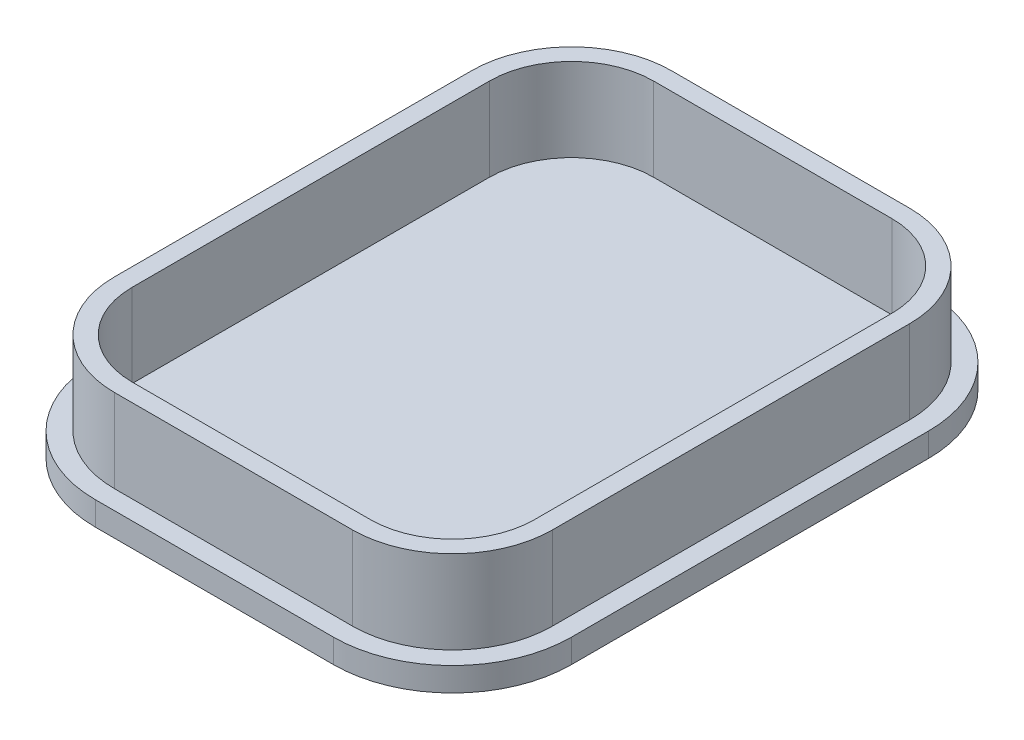
ISO-10303-21;
HEADER;
FILE_DESCRIPTION(('STEP AP214'),'2;1');
FILE_NAME('part.step','',(''),(''),'','','');
FILE_SCHEMA(('AUTOMOTIVE_DESIGN { 1 0 10303 214 1 1 1 1 }'));
ENDSEC;
DATA;
#1=APPLICATION_CONTEXT('core data for automotive mechanical design processes');
#2=APPLICATION_PROTOCOL_DEFINITION('international standard','automotive_design',2000,#1);
#3=PRODUCT_CONTEXT('',#1,'mechanical');
#4=PRODUCT('Part','Part','',(#3));
#5=PRODUCT_RELATED_PRODUCT_CATEGORY('part','',(#4));
#6=PRODUCT_DEFINITION_FORMATION('','',#4);
#7=PRODUCT_DEFINITION_CONTEXT('part definition',#1,'design');
#8=PRODUCT_DEFINITION('design','',#6,#7);
#9=PRODUCT_DEFINITION_SHAPE('','',#8);
#10=(LENGTH_UNIT() NAMED_UNIT(*) SI_UNIT(.MILLI.,.METRE.));
#11=(NAMED_UNIT(*) PLANE_ANGLE_UNIT() SI_UNIT($,.RADIAN.));
#12=(NAMED_UNIT(*) SI_UNIT($,.STERADIAN.) SOLID_ANGLE_UNIT());
#13=UNCERTAINTY_MEASURE_WITH_UNIT(LENGTH_MEASURE(1.E-05),#10,'distance_accuracy_value','');
#14=(GEOMETRIC_REPRESENTATION_CONTEXT(3) GLOBAL_UNCERTAINTY_ASSIGNED_CONTEXT((#13)) GLOBAL_UNIT_ASSIGNED_CONTEXT((#10,
#11,#12)) REPRESENTATION_CONTEXT('',''));
#15=CARTESIAN_POINT('',(0.,0.,0.));
#16=DIRECTION('',(0.,0.,1.));
#17=DIRECTION('',(1.,0.,0.));
#18=AXIS2_PLACEMENT_3D('',#15,#16,#17);
#19=CARTESIAN_POINT('',(9.65118240512013,2.,-15.2386014533297));
#20=DIRECTION('',(0.,-1.,0.));
#21=DIRECTION('',(0.,0.,-1.));
#22=AXIS2_PLACEMENT_3D('',#19,#20,#21);
#23=PLANE('',#22);
#24=CARTESIAN_POINT('',(9.65118240512013,2.,-15.2386014533297));
#25=DIRECTION('',(0.,1.,0.));
#26=DIRECTION('',(0.,0.,-1.));
#27=AXIS2_PLACEMENT_3D('',#24,#25,#26);
#28=CIRCLE('',#27,10.);
#29=CARTESIAN_POINT('',(19.6511824051201,2.,-15.2386014533297));
#30=VERTEX_POINT('',#29);
#31=CARTESIAN_POINT('',(9.65118240512013,2.,-25.2386014533297));
#32=VERTEX_POINT('',#31);
#33=EDGE_CURVE('E324',#30,#32,#28,.T.);
#34=ORIENTED_EDGE('',*,*,#33,.T.);
#35=DIRECTION('',(-1.,0.,0.));
#36=VECTOR('',#35,1.);
#37=CARTESIAN_POINT('',(-10.3488175948799,2.,-25.2386014533297));
#38=LINE('',#37,#36);
#39=CARTESIAN_POINT('',(-10.3488175948799,2.,-25.2386014533297));
#40=VERTEX_POINT('',#39);
#41=EDGE_CURVE('E327',#32,#40,#38,.T.);
#42=ORIENTED_EDGE('',*,*,#41,.T.);
#43=CARTESIAN_POINT('',(-10.3488175948799,2.,-15.2386014533297));
#44=DIRECTION('',(0.,1.,0.));
#45=DIRECTION('',(0.,0.,-1.));
#46=AXIS2_PLACEMENT_3D('',#43,#44,#45);
#47=CIRCLE('',#46,10.);
#48=CARTESIAN_POINT('',(-20.3488175948799,2.,-15.2386014533297));
#49=VERTEX_POINT('',#48);
#50=EDGE_CURVE('E330',#40,#49,#47,.T.);
#51=ORIENTED_EDGE('',*,*,#50,.T.);
#52=DIRECTION('',(0.,0.,1.));
#53=VECTOR('',#52,1.);
#54=CARTESIAN_POINT('',(-20.3488175948799,2.,14.7613985466703));
#55=LINE('',#54,#53);
#56=CARTESIAN_POINT('',(-20.3488175948799,2.,14.7613985466703));
#57=VERTEX_POINT('',#56);
#58=EDGE_CURVE('E332',#49,#57,#55,.T.);
#59=ORIENTED_EDGE('',*,*,#58,.T.);
#60=CARTESIAN_POINT('',(-10.3488175948799,2.,14.7613985466703));
#61=DIRECTION('',(0.,1.,0.));
#62=DIRECTION('',(0.,0.,-1.));
#63=AXIS2_PLACEMENT_3D('',#60,#61,#62);
#64=CIRCLE('',#63,10.);
#65=CARTESIAN_POINT('',(-10.3488175948799,2.,24.7613985466703));
#66=VERTEX_POINT('',#65);
#67=EDGE_CURVE('E334',#57,#66,#64,.T.);
#68=ORIENTED_EDGE('',*,*,#67,.T.);
#69=DIRECTION('',(1.,0.,0.));
#70=VECTOR('',#69,1.);
#71=CARTESIAN_POINT('',(-10.3488175948799,2.,24.7613985466703));
#72=LINE('',#71,#70);
#73=CARTESIAN_POINT('',(9.65118240512013,2.,24.7613985466703));
#74=VERTEX_POINT('',#73);
#75=EDGE_CURVE('E336',#66,#74,#72,.T.);
#76=ORIENTED_EDGE('',*,*,#75,.T.);
#77=CARTESIAN_POINT('',(9.65118240512013,2.,14.7613985466703));
#78=DIRECTION('',(0.,1.,0.));
#79=DIRECTION('',(0.,0.,1.));
#80=AXIS2_PLACEMENT_3D('',#77,#78,#79);
#81=CIRCLE('',#80,10.);
#82=CARTESIAN_POINT('',(19.6511824051201,2.,14.7613985466703));
#83=VERTEX_POINT('',#82);
#84=EDGE_CURVE('E338',#74,#83,#81,.T.);
#85=ORIENTED_EDGE('',*,*,#84,.T.);
#86=DIRECTION('',(0.,0.,-1.));
#87=VECTOR('',#86,1.);
#88=CARTESIAN_POINT('',(19.6511824051201,2.,14.7613985466703));
#89=LINE('',#88,#87);
#90=EDGE_CURVE('E340',#83,#30,#89,.T.);
#91=ORIENTED_EDGE('',*,*,#90,.T.);
#92=EDGE_LOOP('',(#34,#42,#51,#59,#68,#76,#85,#91));
#93=FACE_BOUND('',#92,.T.);
#94=CARTESIAN_POINT('',(-10.3488175948799,2.,-15.2386014533297));
#95=DIRECTION('',(0.,1.,0.));
#96=DIRECTION('',(0.,0.,1.));
#97=AXIS2_PLACEMENT_3D('',#94,#95,#96);
#98=CIRCLE('',#97,8.4);
#99=CARTESIAN_POINT('',(-10.3488175948799,2.,-23.6386014533297));
#100=VERTEX_POINT('',#99);
#101=CARTESIAN_POINT('',(-18.7488175948799,2.,-15.2386014533297));
#102=VERTEX_POINT('',#101);
#103=EDGE_CURVE('E211',#100,#102,#98,.T.);
#104=ORIENTED_EDGE('',*,*,#103,.F.);
#105=DIRECTION('',(-1.,0.,0.));
#106=VECTOR('',#105,1.);
#107=CARTESIAN_POINT('',(9.65118240512013,2.,-23.6386014533297));
#108=LINE('',#107,#106);
#109=CARTESIAN_POINT('',(9.65118240512014,2.,-23.6386014533297));
#110=VERTEX_POINT('',#109);
#111=EDGE_CURVE('E268',#110,#100,#108,.T.);
#112=ORIENTED_EDGE('',*,*,#111,.F.);
#113=CARTESIAN_POINT('',(9.65118240512013,2.,-15.2386014533297));
#114=DIRECTION('',(0.,1.,0.));
#115=DIRECTION('',(0.,0.,1.));
#116=AXIS2_PLACEMENT_3D('',#113,#114,#115);
#117=CIRCLE('',#116,8.4);
#118=CARTESIAN_POINT('',(18.0511824051201,2.,-15.2386014533297));
#119=VERTEX_POINT('',#118);
#120=EDGE_CURVE('E296',#119,#110,#117,.T.);
#121=ORIENTED_EDGE('',*,*,#120,.F.);
#122=DIRECTION('',(0.,0.,-1.));
#123=VECTOR('',#122,1.);
#124=CARTESIAN_POINT('',(18.0511824051201,2.,14.7613985466703));
#125=LINE('',#124,#123);
#126=CARTESIAN_POINT('',(18.0511824051201,2.,14.7613985466703));
#127=VERTEX_POINT('',#126);
#128=EDGE_CURVE('E293',#127,#119,#125,.T.);
#129=ORIENTED_EDGE('',*,*,#128,.F.);
#130=CARTESIAN_POINT('',(9.65118240512013,2.,14.7613985466703));
#131=DIRECTION('',(0.,1.,0.));
#132=DIRECTION('',(0.,0.,1.));
#133=AXIS2_PLACEMENT_3D('',#130,#131,#132);
#134=CIRCLE('',#133,8.4);
#135=CARTESIAN_POINT('',(9.65118240512014,2.,23.1613985466703));
#136=VERTEX_POINT('',#135);
#137=EDGE_CURVE('E290',#136,#127,#134,.T.);
#138=ORIENTED_EDGE('',*,*,#137,.F.);
#139=DIRECTION('',(1.,0.,0.));
#140=VECTOR('',#139,1.);
#141=CARTESIAN_POINT('',(-10.3488175948799,2.,23.1613985466703));
#142=LINE('',#141,#140);
#143=CARTESIAN_POINT('',(-10.3488175948799,2.,23.1613985466703));
#144=VERTEX_POINT('',#143);
#145=EDGE_CURVE('E287',#144,#136,#142,.T.);
#146=ORIENTED_EDGE('',*,*,#145,.F.);
#147=CARTESIAN_POINT('',(-10.3488175948799,2.,14.7613985466703));
#148=DIRECTION('',(0.,1.,0.));
#149=DIRECTION('',(0.,0.,1.));
#150=AXIS2_PLACEMENT_3D('',#147,#148,#149);
#151=CIRCLE('',#150,8.4);
#152=CARTESIAN_POINT('',(-18.7488175948799,2.,14.7613985466703));
#153=VERTEX_POINT('',#152);
#154=EDGE_CURVE('E53',#153,#144,#151,.T.);
#155=ORIENTED_EDGE('',*,*,#154,.F.);
#156=DIRECTION('',(0.,0.,1.));
#157=VECTOR('',#156,1.);
#158=CARTESIAN_POINT('',(-18.7488175948799,2.,-15.2386014533297));
#159=LINE('',#158,#157);
#160=EDGE_CURVE('E48',#102,#153,#159,.T.);
#161=ORIENTED_EDGE('',*,*,#160,.F.);
#162=EDGE_LOOP('',(#104,#112,#121,#129,#138,#146,#155,#161));
#163=FACE_BOUND('',#162,.T.);
#164=ADVANCED_FACE('F33',(#93,#163),#23,.F.);
#165=CARTESIAN_POINT('',(9.65118240512013,2.,-15.2386014533297));
#166=DIRECTION('',(0.,-1.,0.));
#167=DIRECTION('',(0.,0.,-1.));
#168=AXIS2_PLACEMENT_3D('',#165,#166,#167);
#169=CYLINDRICAL_SURFACE('',#168,10.);
#170=CARTESIAN_POINT('',(9.65118240512013,0.,-15.2386014533297));
#171=DIRECTION('',(0.,1.,0.));
#172=DIRECTION('',(0.,0.,-1.));
#173=AXIS2_PLACEMENT_3D('',#170,#171,#172);
#174=CIRCLE('',#173,10.);
#175=CARTESIAN_POINT('',(19.6511824051201,0.,-15.2386014533297));
#176=VERTEX_POINT('',#175);
#177=CARTESIAN_POINT('',(9.65118240512013,0.,-25.2386014533297));
#178=VERTEX_POINT('',#177);
#179=EDGE_CURVE('E323',#176,#178,#174,.T.);
#180=ORIENTED_EDGE('',*,*,#179,.T.);
#181=DIRECTION('',(0.,-1.,0.));
#182=VECTOR('',#181,1.);
#183=CARTESIAN_POINT('',(9.65118240512013,2.,-25.2386014533297));
#184=LINE('',#183,#182);
#185=EDGE_CURVE('E11',#32,#178,#184,.T.);
#186=ORIENTED_EDGE('',*,*,#185,.F.);
#187=ORIENTED_EDGE('',*,*,#33,.F.);
#188=DIRECTION('',(0.,-1.,0.));
#189=VECTOR('',#188,1.);
#190=CARTESIAN_POINT('',(19.6511824051201,2.,-15.2386014533297));
#191=LINE('',#190,#189);
#192=EDGE_CURVE('E342',#30,#176,#191,.T.);
#193=ORIENTED_EDGE('',*,*,#192,.T.);
#194=EDGE_LOOP('',(#180,#186,#187,#193));
#195=FACE_BOUND('',#194,.T.);
#196=ADVANCED_FACE('F35',(#195),#169,.T.);
#197=CARTESIAN_POINT('',(-10.3488175948799,2.,-25.2386014533297));
#198=DIRECTION('',(0.,0.,1.));
#199=DIRECTION('',(1.,0.,0.));
#200=AXIS2_PLACEMENT_3D('',#197,#198,#199);
#201=PLANE('',#200);
#202=DIRECTION('',(-1.,0.,0.));
#203=VECTOR('',#202,1.);
#204=CARTESIAN_POINT('',(-10.3488175948799,0.,-25.2386014533297));
#205=LINE('',#204,#203);
#206=CARTESIAN_POINT('',(-10.3488175948799,0.,-25.2386014533297));
#207=VERTEX_POINT('',#206);
#208=EDGE_CURVE('E345',#178,#207,#205,.T.);
#209=ORIENTED_EDGE('',*,*,#208,.T.);
#210=DIRECTION('',(0.,-1.,0.));
#211=VECTOR('',#210,1.);
#212=CARTESIAN_POINT('',(-10.3488175948799,2.,-25.2386014533297));
#213=LINE('',#212,#211);
#214=EDGE_CURVE('E41',#40,#207,#213,.T.);
#215=ORIENTED_EDGE('',*,*,#214,.F.);
#216=ORIENTED_EDGE('',*,*,#41,.F.);
#217=ORIENTED_EDGE('',*,*,#185,.T.);
#218=EDGE_LOOP('',(#209,#215,#216,#217));
#219=FACE_BOUND('',#218,.T.);
#220=ADVANCED_FACE('F401',(#219),#201,.F.);
#221=CARTESIAN_POINT('',(-10.3488175948799,2.,-15.2386014533297));
#222=DIRECTION('',(0.,-1.,0.));
#223=DIRECTION('',(0.,0.,-1.));
#224=AXIS2_PLACEMENT_3D('',#221,#222,#223);
#225=CYLINDRICAL_SURFACE('',#224,10.);
#226=CARTESIAN_POINT('',(-10.3488175948799,0.,-15.2386014533297));
#227=DIRECTION('',(0.,1.,0.));
#228=DIRECTION('',(0.,0.,-1.));
#229=AXIS2_PLACEMENT_3D('',#226,#227,#228);
#230=CIRCLE('',#229,10.);
#231=CARTESIAN_POINT('',(-20.3488175948799,0.,-15.2386014533297));
#232=VERTEX_POINT('',#231);
#233=EDGE_CURVE('E347',#207,#232,#230,.T.);
#234=ORIENTED_EDGE('',*,*,#233,.T.);
#235=DIRECTION('',(0.,-1.,0.));
#236=VECTOR('',#235,1.);
#237=CARTESIAN_POINT('',(-20.3488175948799,2.,-15.2386014533297));
#238=LINE('',#237,#236);
#239=EDGE_CURVE('E372',#49,#232,#238,.T.);
#240=ORIENTED_EDGE('',*,*,#239,.F.);
#241=ORIENTED_EDGE('',*,*,#50,.F.);
#242=ORIENTED_EDGE('',*,*,#214,.T.);
#243=EDGE_LOOP('',(#234,#240,#241,#242));
#244=FACE_BOUND('',#243,.T.);
#245=ADVANCED_FACE('F379',(#244),#225,.T.);
#246=CARTESIAN_POINT('',(-20.3488175948799,2.,14.7613985466703));
#247=DIRECTION('',(1.,0.,0.));
#248=DIRECTION('',(0.,0.,-1.));
#249=AXIS2_PLACEMENT_3D('',#246,#247,#248);
#250=PLANE('',#249);
#251=DIRECTION('',(0.,0.,1.));
#252=VECTOR('',#251,1.);
#253=CARTESIAN_POINT('',(-20.3488175948799,0.,14.7613985466703));
#254=LINE('',#253,#252);
#255=CARTESIAN_POINT('',(-20.3488175948799,0.,14.7613985466703));
#256=VERTEX_POINT('',#255);
#257=EDGE_CURVE('E349',#232,#256,#254,.T.);
#258=ORIENTED_EDGE('',*,*,#257,.T.);
#259=DIRECTION('',(0.,-1.,0.));
#260=VECTOR('',#259,1.);
#261=CARTESIAN_POINT('',(-20.3488175948799,2.,14.7613985466703));
#262=LINE('',#261,#260);
#263=EDGE_CURVE('E369',#57,#256,#262,.T.);
#264=ORIENTED_EDGE('',*,*,#263,.F.);
#265=ORIENTED_EDGE('',*,*,#58,.F.);
#266=ORIENTED_EDGE('',*,*,#239,.T.);
#267=EDGE_LOOP('',(#258,#264,#265,#266));
#268=FACE_BOUND('',#267,.T.);
#269=ADVANCED_FACE('F390',(#268),#250,.F.);
#270=CARTESIAN_POINT('',(-10.3488175948799,2.,14.7613985466703));
#271=DIRECTION('',(0.,-1.,0.));
#272=DIRECTION('',(0.,0.,-1.));
#273=AXIS2_PLACEMENT_3D('',#270,#271,#272);
#274=CYLINDRICAL_SURFACE('',#273,10.);
#275=CARTESIAN_POINT('',(-10.3488175948799,0.,14.7613985466703));
#276=DIRECTION('',(0.,1.,0.));
#277=DIRECTION('',(0.,0.,-1.));
#278=AXIS2_PLACEMENT_3D('',#275,#276,#277);
#279=CIRCLE('',#278,10.);
#280=CARTESIAN_POINT('',(-10.3488175948799,0.,24.7613985466703));
#281=VERTEX_POINT('',#280);
#282=EDGE_CURVE('E351',#256,#281,#279,.T.);
#283=ORIENTED_EDGE('',*,*,#282,.T.);
#284=DIRECTION('',(0.,-1.,0.));
#285=VECTOR('',#284,1.);
#286=CARTESIAN_POINT('',(-10.3488175948799,2.,24.7613985466703));
#287=LINE('',#286,#285);
#288=EDGE_CURVE('E366',#66,#281,#287,.T.);
#289=ORIENTED_EDGE('',*,*,#288,.F.);
#290=ORIENTED_EDGE('',*,*,#67,.F.);
#291=ORIENTED_EDGE('',*,*,#263,.T.);
#292=EDGE_LOOP('',(#283,#289,#290,#291));
#293=FACE_BOUND('',#292,.T.);
#294=ADVANCED_FACE('F394',(#293),#274,.T.);
#295=CARTESIAN_POINT('',(-10.3488175948799,2.,24.7613985466703));
#296=DIRECTION('',(0.,0.,-1.));
#297=DIRECTION('',(-1.,0.,0.));
#298=AXIS2_PLACEMENT_3D('',#295,#296,#297);
#299=PLANE('',#298);
#300=DIRECTION('',(1.,0.,0.));
#301=VECTOR('',#300,1.);
#302=CARTESIAN_POINT('',(-10.3488175948799,0.,24.7613985466703));
#303=LINE('',#302,#301);
#304=CARTESIAN_POINT('',(9.65118240512013,0.,24.7613985466703));
#305=VERTEX_POINT('',#304);
#306=EDGE_CURVE('E353',#281,#305,#303,.T.);
#307=ORIENTED_EDGE('',*,*,#306,.T.);
#308=DIRECTION('',(0.,-1.,0.));
#309=VECTOR('',#308,1.);
#310=CARTESIAN_POINT('',(9.65118240512013,2.,24.7613985466703));
#311=LINE('',#310,#309);
#312=EDGE_CURVE('E363',#74,#305,#311,.T.);
#313=ORIENTED_EDGE('',*,*,#312,.F.);
#314=ORIENTED_EDGE('',*,*,#75,.F.);
#315=ORIENTED_EDGE('',*,*,#288,.T.);
#316=EDGE_LOOP('',(#307,#313,#314,#315));
#317=FACE_BOUND('',#316,.T.);
#318=ADVANCED_FACE('F414',(#317),#299,.F.);
#319=CARTESIAN_POINT('',(9.65118240512013,2.,14.7613985466703));
#320=DIRECTION('',(0.,-1.,0.));
#321=DIRECTION('',(0.,0.,-1.));
#322=AXIS2_PLACEMENT_3D('',#319,#320,#321);
#323=CYLINDRICAL_SURFACE('',#322,10.);
#324=CARTESIAN_POINT('',(9.65118240512013,0.,14.7613985466703));
#325=DIRECTION('',(0.,1.,0.));
#326=DIRECTION('',(0.,0.,1.));
#327=AXIS2_PLACEMENT_3D('',#324,#325,#326);
#328=CIRCLE('',#327,10.);
#329=CARTESIAN_POINT('',(19.6511824051201,0.,14.7613985466703));
#330=VERTEX_POINT('',#329);
#331=EDGE_CURVE('E355',#305,#330,#328,.T.);
#332=ORIENTED_EDGE('',*,*,#331,.T.);
#333=DIRECTION('',(0.,-1.,0.));
#334=VECTOR('',#333,1.);
#335=CARTESIAN_POINT('',(19.6511824051201,2.,14.7613985466703));
#336=LINE('',#335,#334);
#337=EDGE_CURVE('E360',#83,#330,#336,.T.);
#338=ORIENTED_EDGE('',*,*,#337,.F.);
#339=ORIENTED_EDGE('',*,*,#84,.F.);
#340=ORIENTED_EDGE('',*,*,#312,.T.);
#341=EDGE_LOOP('',(#332,#338,#339,#340));
#342=FACE_BOUND('',#341,.T.);
#343=ADVANCED_FACE('F412',(#342),#323,.T.);
#344=CARTESIAN_POINT('',(19.6511824051201,2.,14.7613985466703));
#345=DIRECTION('',(-1.,0.,0.));
#346=DIRECTION('',(0.,0.,1.));
#347=AXIS2_PLACEMENT_3D('',#344,#345,#346);
#348=PLANE('',#347);
#349=DIRECTION('',(0.,0.,-1.));
#350=VECTOR('',#349,1.);
#351=CARTESIAN_POINT('',(19.6511824051201,0.,14.7613985466703));
#352=LINE('',#351,#350);
#353=EDGE_CURVE('E328',#330,#176,#352,.T.);
#354=ORIENTED_EDGE('',*,*,#353,.T.);
#355=ORIENTED_EDGE('',*,*,#192,.F.);
#356=ORIENTED_EDGE('',*,*,#90,.F.);
#357=ORIENTED_EDGE('',*,*,#337,.T.);
#358=EDGE_LOOP('',(#354,#355,#356,#357));
#359=FACE_BOUND('',#358,.T.);
#360=ADVANCED_FACE('F407',(#359),#348,.F.);
#361=CARTESIAN_POINT('',(9.65118240512013,0.,-15.2386014533297));
#362=DIRECTION('',(0.,-1.,0.));
#363=DIRECTION('',(0.,0.,-1.));
#364=AXIS2_PLACEMENT_3D('',#361,#362,#363);
#365=PLANE('',#364);
#366=ORIENTED_EDGE('',*,*,#179,.F.);
#367=ORIENTED_EDGE('',*,*,#353,.F.);
#368=ORIENTED_EDGE('',*,*,#331,.F.);
#369=ORIENTED_EDGE('',*,*,#306,.F.);
#370=ORIENTED_EDGE('',*,*,#282,.F.);
#371=ORIENTED_EDGE('',*,*,#257,.F.);
#372=ORIENTED_EDGE('',*,*,#233,.F.);
#373=ORIENTED_EDGE('',*,*,#208,.F.);
#374=EDGE_LOOP('',(#366,#367,#368,#369,#370,#371,#372,#373));
#375=FACE_BOUND('',#374,.T.);
#376=ADVANCED_FACE('F385',(#375),#365,.T.);
#377=CARTESIAN_POINT('',(-10.3488175948799,9.,-15.2386014533297));
#378=DIRECTION('',(0.,1.,0.));
#379=DIRECTION('',(0.,0.,1.));
#380=AXIS2_PLACEMENT_3D('',#377,#378,#379);
#381=PLANE('',#380);
#382=CARTESIAN_POINT('',(-10.3488175948799,9.,-15.2386014533297));
#383=DIRECTION('',(0.,1.,0.));
#384=DIRECTION('',(0.,0.,1.));
#385=AXIS2_PLACEMENT_3D('',#382,#383,#384);
#386=CIRCLE('',#385,8.4);
#387=CARTESIAN_POINT('',(-10.3488175948799,9.,-23.6386014533297));
#388=VERTEX_POINT('',#387);
#389=CARTESIAN_POINT('',(-18.7488175948799,9.,-15.2386014533297));
#390=VERTEX_POINT('',#389);
#391=EDGE_CURVE('E264',#388,#390,#386,.T.);
#392=ORIENTED_EDGE('',*,*,#391,.T.);
#393=DIRECTION('',(0.,0.,1.));
#394=VECTOR('',#393,1.);
#395=CARTESIAN_POINT('',(-18.7488175948799,9.,-15.2386014533297));
#396=LINE('',#395,#394);
#397=CARTESIAN_POINT('',(-18.7488175948799,9.,14.7613985466703));
#398=VERTEX_POINT('',#397);
#399=EDGE_CURVE('E267',#390,#398,#396,.T.);
#400=ORIENTED_EDGE('',*,*,#399,.T.);
#401=CARTESIAN_POINT('',(-10.3488175948799,9.,14.7613985466703));
#402=DIRECTION('',(0.,1.,0.));
#403=DIRECTION('',(0.,0.,1.));
#404=AXIS2_PLACEMENT_3D('',#401,#402,#403);
#405=CIRCLE('',#404,8.4);
#406=CARTESIAN_POINT('',(-10.3488175948799,9.,23.1613985466703));
#407=VERTEX_POINT('',#406);
#408=EDGE_CURVE('E270',#398,#407,#405,.T.);
#409=ORIENTED_EDGE('',*,*,#408,.T.);
#410=DIRECTION('',(1.,0.,0.));
#411=VECTOR('',#410,1.);
#412=CARTESIAN_POINT('',(-10.3488175948799,9.,23.1613985466703));
#413=LINE('',#412,#411);
#414=CARTESIAN_POINT('',(9.65118240512014,9.,23.1613985466703));
#415=VERTEX_POINT('',#414);
#416=EDGE_CURVE('E272',#407,#415,#413,.T.);
#417=ORIENTED_EDGE('',*,*,#416,.T.);
#418=CARTESIAN_POINT('',(9.65118240512013,9.,14.7613985466703));
#419=DIRECTION('',(0.,1.,0.));
#420=DIRECTION('',(0.,0.,1.));
#421=AXIS2_PLACEMENT_3D('',#418,#419,#420);
#422=CIRCLE('',#421,8.4);
#423=CARTESIAN_POINT('',(18.0511824051201,9.,14.7613985466703));
#424=VERTEX_POINT('',#423);
#425=EDGE_CURVE('E274',#415,#424,#422,.T.);
#426=ORIENTED_EDGE('',*,*,#425,.T.);
#427=DIRECTION('',(0.,0.,-1.));
#428=VECTOR('',#427,1.);
#429=CARTESIAN_POINT('',(18.0511824051201,9.,14.7613985466703));
#430=LINE('',#429,#428);
#431=CARTESIAN_POINT('',(18.0511824051201,9.,-15.2386014533297));
#432=VERTEX_POINT('',#431);
#433=EDGE_CURVE('E276',#424,#432,#430,.T.);
#434=ORIENTED_EDGE('',*,*,#433,.T.);
#435=CARTESIAN_POINT('',(9.65118240512013,9.,-15.2386014533297));
#436=DIRECTION('',(0.,1.,0.));
#437=DIRECTION('',(0.,0.,1.));
#438=AXIS2_PLACEMENT_3D('',#435,#436,#437);
#439=CIRCLE('',#438,8.4);
#440=CARTESIAN_POINT('',(9.65118240512014,9.,-23.6386014533297));
#441=VERTEX_POINT('',#440);
#442=EDGE_CURVE('E278',#432,#441,#439,.T.);
#443=ORIENTED_EDGE('',*,*,#442,.T.);
#444=DIRECTION('',(-1.,0.,0.));
#445=VECTOR('',#444,1.);
#446=CARTESIAN_POINT('',(9.65118240512013,9.,-23.6386014533297));
#447=LINE('',#446,#445);
#448=EDGE_CURVE('E280',#441,#388,#447,.T.);
#449=ORIENTED_EDGE('',*,*,#448,.T.);
#450=EDGE_LOOP('',(#392,#400,#409,#417,#426,#434,#443,#449));
#451=FACE_BOUND('',#450,.T.);
#452=DIRECTION('',(0.,0.,1.));
#453=VECTOR('',#452,1.);
#454=CARTESIAN_POINT('',(-17.2488175948799,9.,-15.2386014533297));
#455=LINE('',#454,#453);
#456=CARTESIAN_POINT('',(-17.2488175948799,9.,-15.2386014533297));
#457=VERTEX_POINT('',#456);
#458=CARTESIAN_POINT('',(-17.2488175948799,9.,14.7613985466703));
#459=VERTEX_POINT('',#458);
#460=EDGE_CURVE('E203',#457,#459,#455,.T.);
#461=ORIENTED_EDGE('',*,*,#460,.F.);
#462=CARTESIAN_POINT('',(-10.3488175948799,9.,-15.2386014533297));
#463=DIRECTION('',(0.,1.,0.));
#464=DIRECTION('',(0.,0.,1.));
#465=AXIS2_PLACEMENT_3D('',#462,#463,#464);
#466=CIRCLE('',#465,6.9);
#467=CARTESIAN_POINT('',(-10.3488175948799,9.,-22.1386014533297));
#468=VERTEX_POINT('',#467);
#469=EDGE_CURVE('E193',#468,#457,#466,.T.);
#470=ORIENTED_EDGE('',*,*,#469,.F.);
#471=DIRECTION('',(-1.,0.,0.));
#472=VECTOR('',#471,1.);
#473=CARTESIAN_POINT('',(9.65118240512013,9.,-22.1386014533297));
#474=LINE('',#473,#472);
#475=CARTESIAN_POINT('',(9.65118240512013,9.,-22.1386014533297));
#476=VERTEX_POINT('',#475);
#477=EDGE_CURVE('E230',#476,#468,#474,.T.);
#478=ORIENTED_EDGE('',*,*,#477,.F.);
#479=CARTESIAN_POINT('',(9.65118240512013,9.,-15.2386014533297));
#480=DIRECTION('',(0.,1.,0.));
#481=DIRECTION('',(0.,0.,1.));
#482=AXIS2_PLACEMENT_3D('',#479,#480,#481);
#483=CIRCLE('',#482,6.9);
#484=CARTESIAN_POINT('',(16.5511824051201,9.,-15.2386014533297));
#485=VERTEX_POINT('',#484);
#486=EDGE_CURVE('E227',#485,#476,#483,.T.);
#487=ORIENTED_EDGE('',*,*,#486,.F.);
#488=DIRECTION('',(0.,0.,-1.));
#489=VECTOR('',#488,1.);
#490=CARTESIAN_POINT('',(16.5511824051201,9.,14.7613985466703));
#491=LINE('',#490,#489);
#492=CARTESIAN_POINT('',(16.5511824051201,9.,14.7613985466703));
#493=VERTEX_POINT('',#492);
#494=EDGE_CURVE('E225',#493,#485,#491,.T.);
#495=ORIENTED_EDGE('',*,*,#494,.F.);
#496=CARTESIAN_POINT('',(9.65118240512013,9.,14.7613985466703));
#497=DIRECTION('',(0.,1.,0.));
#498=DIRECTION('',(0.,0.,1.));
#499=AXIS2_PLACEMENT_3D('',#496,#497,#498);
#500=CIRCLE('',#499,6.9);
#501=CARTESIAN_POINT('',(9.65118240512014,9.,21.6613985466703));
#502=VERTEX_POINT('',#501);
#503=EDGE_CURVE('E223',#502,#493,#500,.T.);
#504=ORIENTED_EDGE('',*,*,#503,.F.);
#505=DIRECTION('',(1.,0.,0.));
#506=VECTOR('',#505,1.);
#507=CARTESIAN_POINT('',(-10.3488175948799,9.,21.6613985466703));
#508=LINE('',#507,#506);
#509=CARTESIAN_POINT('',(-10.3488175948799,9.,21.6613985466703));
#510=VERTEX_POINT('',#509);
#511=EDGE_CURVE('E219',#510,#502,#508,.T.);
#512=ORIENTED_EDGE('',*,*,#511,.F.);
#513=CARTESIAN_POINT('',(-10.3488175948799,9.,14.7613985466703));
#514=DIRECTION('',(0.,1.,0.));
#515=DIRECTION('',(0.,0.,1.));
#516=AXIS2_PLACEMENT_3D('',#513,#514,#515);
#517=CIRCLE('',#516,6.9);
#518=EDGE_CURVE('E217',#459,#510,#517,.T.);
#519=ORIENTED_EDGE('',*,*,#518,.F.);
#520=EDGE_LOOP('',(#461,#470,#478,#487,#495,#504,#512,#519));
#521=FACE_BOUND('',#520,.T.);
#522=ADVANCED_FACE('F215',(#451,#521),#381,.T.);
#523=CARTESIAN_POINT('',(-10.3488175948799,9.,-15.2386014533297));
#524=DIRECTION('',(0.,-1.,0.));
#525=DIRECTION('',(0.,0.,-1.));
#526=AXIS2_PLACEMENT_3D('',#523,#524,#525);
#527=CYLINDRICAL_SURFACE('',#526,8.4);
#528=ORIENTED_EDGE('',*,*,#103,.T.);
#529=DIRECTION('',(0.,-1.,0.));
#530=VECTOR('',#529,1.);
#531=CARTESIAN_POINT('',(-18.7488175948799,9.,-15.2386014533297));
#532=LINE('',#531,#530);
#533=EDGE_CURVE('E321',#390,#102,#532,.T.);
#534=ORIENTED_EDGE('',*,*,#533,.F.);
#535=ORIENTED_EDGE('',*,*,#391,.F.);
#536=DIRECTION('',(0.,-1.,0.));
#537=VECTOR('',#536,1.);
#538=CARTESIAN_POINT('',(-10.3488175948799,9.,-23.6386014533297));
#539=LINE('',#538,#537);
#540=EDGE_CURVE('E282',#388,#100,#539,.T.);
#541=ORIENTED_EDGE('',*,*,#540,.T.);
#542=EDGE_LOOP('',(#528,#534,#535,#541));
#543=FACE_BOUND('',#542,.T.);
#544=ADVANCED_FACE('F477',(#543),#527,.T.);
#545=CARTESIAN_POINT('',(-18.7488175948799,9.,-15.2386014533297));
#546=DIRECTION('',(1.,0.,0.));
#547=DIRECTION('',(0.,0.,-1.));
#548=AXIS2_PLACEMENT_3D('',#545,#546,#547);
#549=PLANE('',#548);
#550=ORIENTED_EDGE('',*,*,#160,.T.);
#551=DIRECTION('',(0.,-1.,0.));
#552=VECTOR('',#551,1.);
#553=CARTESIAN_POINT('',(-18.7488175948799,9.,14.7613985466703));
#554=LINE('',#553,#552);
#555=EDGE_CURVE('E318',#398,#153,#554,.T.);
#556=ORIENTED_EDGE('',*,*,#555,.F.);
#557=ORIENTED_EDGE('',*,*,#399,.F.);
#558=ORIENTED_EDGE('',*,*,#533,.T.);
#559=EDGE_LOOP('',(#550,#556,#557,#558));
#560=FACE_BOUND('',#559,.T.);
#561=ADVANCED_FACE('F501',(#560),#549,.F.);
#562=CARTESIAN_POINT('',(-10.3488175948799,9.,14.7613985466703));
#563=DIRECTION('',(0.,-1.,0.));
#564=DIRECTION('',(0.,0.,-1.));
#565=AXIS2_PLACEMENT_3D('',#562,#563,#564);
#566=CYLINDRICAL_SURFACE('',#565,8.4);
#567=ORIENTED_EDGE('',*,*,#154,.T.);
#568=DIRECTION('',(0.,-1.,0.));
#569=VECTOR('',#568,1.);
#570=CARTESIAN_POINT('',(-10.3488175948799,9.,23.1613985466703));
#571=LINE('',#570,#569);
#572=EDGE_CURVE('E315',#407,#144,#571,.T.);
#573=ORIENTED_EDGE('',*,*,#572,.F.);
#574=ORIENTED_EDGE('',*,*,#408,.F.);
#575=ORIENTED_EDGE('',*,*,#555,.T.);
#576=EDGE_LOOP('',(#567,#573,#574,#575));
#577=FACE_BOUND('',#576,.T.);
#578=ADVANCED_FACE('F497',(#577),#566,.T.);
#579=CARTESIAN_POINT('',(-10.3488175948799,9.,23.1613985466703));
#580=DIRECTION('',(0.,0.,-1.));
#581=DIRECTION('',(-1.,0.,0.));
#582=AXIS2_PLACEMENT_3D('',#579,#580,#581);
#583=PLANE('',#582);
#584=ORIENTED_EDGE('',*,*,#145,.T.);
#585=DIRECTION('',(0.,-1.,0.));
#586=VECTOR('',#585,1.);
#587=CARTESIAN_POINT('',(9.65118240512014,9.,23.1613985466703));
#588=LINE('',#587,#586);
#589=EDGE_CURVE('E312',#415,#136,#588,.T.);
#590=ORIENTED_EDGE('',*,*,#589,.F.);
#591=ORIENTED_EDGE('',*,*,#416,.F.);
#592=ORIENTED_EDGE('',*,*,#572,.T.);
#593=EDGE_LOOP('',(#584,#590,#591,#592));
#594=FACE_BOUND('',#593,.T.);
#595=ADVANCED_FACE('F493',(#594),#583,.F.);
#596=CARTESIAN_POINT('',(9.65118240512013,9.,14.7613985466703));
#597=DIRECTION('',(0.,-1.,0.));
#598=DIRECTION('',(0.,0.,-1.));
#599=AXIS2_PLACEMENT_3D('',#596,#597,#598);
#600=CYLINDRICAL_SURFACE('',#599,8.4);
#601=ORIENTED_EDGE('',*,*,#137,.T.);
#602=DIRECTION('',(0.,-1.,0.));
#603=VECTOR('',#602,1.);
#604=CARTESIAN_POINT('',(18.0511824051201,9.,14.7613985466703));
#605=LINE('',#604,#603);
#606=EDGE_CURVE('E309',#424,#127,#605,.T.);
#607=ORIENTED_EDGE('',*,*,#606,.F.);
#608=ORIENTED_EDGE('',*,*,#425,.F.);
#609=ORIENTED_EDGE('',*,*,#589,.T.);
#610=EDGE_LOOP('',(#601,#607,#608,#609));
#611=FACE_BOUND('',#610,.T.);
#612=ADVANCED_FACE('F489',(#611),#600,.T.);
#613=CARTESIAN_POINT('',(18.0511824051201,9.,14.7613985466703));
#614=DIRECTION('',(-1.,0.,0.));
#615=DIRECTION('',(0.,0.,1.));
#616=AXIS2_PLACEMENT_3D('',#613,#614,#615);
#617=PLANE('',#616);
#618=ORIENTED_EDGE('',*,*,#128,.T.);
#619=DIRECTION('',(0.,-1.,0.));
#620=VECTOR('',#619,1.);
#621=CARTESIAN_POINT('',(18.0511824051201,9.,-15.2386014533297));
#622=LINE('',#621,#620);
#623=EDGE_CURVE('E306',#432,#119,#622,.T.);
#624=ORIENTED_EDGE('',*,*,#623,.F.);
#625=ORIENTED_EDGE('',*,*,#433,.F.);
#626=ORIENTED_EDGE('',*,*,#606,.T.);
#627=EDGE_LOOP('',(#618,#624,#625,#626));
#628=FACE_BOUND('',#627,.T.);
#629=ADVANCED_FACE('F485',(#628),#617,.F.);
#630=CARTESIAN_POINT('',(9.65118240512013,9.,-15.2386014533297));
#631=DIRECTION('',(0.,-1.,0.));
#632=DIRECTION('',(0.,0.,-1.));
#633=AXIS2_PLACEMENT_3D('',#630,#631,#632);
#634=CYLINDRICAL_SURFACE('',#633,8.4);
#635=ORIENTED_EDGE('',*,*,#120,.T.);
#636=DIRECTION('',(0.,-1.,0.));
#637=VECTOR('',#636,1.);
#638=CARTESIAN_POINT('',(9.65118240512014,9.,-23.6386014533297));
#639=LINE('',#638,#637);
#640=EDGE_CURVE('E303',#441,#110,#639,.T.);
#641=ORIENTED_EDGE('',*,*,#640,.F.);
#642=ORIENTED_EDGE('',*,*,#442,.F.);
#643=ORIENTED_EDGE('',*,*,#623,.T.);
#644=EDGE_LOOP('',(#635,#641,#642,#643));
#645=FACE_BOUND('',#644,.T.);
#646=ADVANCED_FACE('F481',(#645),#634,.T.);
#647=CARTESIAN_POINT('',(9.65118240512013,9.,-23.6386014533297));
#648=DIRECTION('',(0.,0.,1.));
#649=DIRECTION('',(1.,0.,0.));
#650=AXIS2_PLACEMENT_3D('',#647,#648,#649);
#651=PLANE('',#650);
#652=ORIENTED_EDGE('',*,*,#111,.T.);
#653=ORIENTED_EDGE('',*,*,#540,.F.);
#654=ORIENTED_EDGE('',*,*,#448,.F.);
#655=ORIENTED_EDGE('',*,*,#640,.T.);
#656=EDGE_LOOP('',(#652,#653,#654,#655));
#657=FACE_BOUND('',#656,.T.);
#658=ADVANCED_FACE('F474',(#657),#651,.F.);
#659=CARTESIAN_POINT('',(-10.3488175948799,9.,-15.2386014533297));
#660=DIRECTION('',(0.,-1.,0.));
#661=DIRECTION('',(0.,0.,-1.));
#662=AXIS2_PLACEMENT_3D('',#659,#660,#661);
#663=CYLINDRICAL_SURFACE('',#662,6.9);
#664=CARTESIAN_POINT('',(-10.3488175948799,2.,-15.2386014533297));
#665=DIRECTION('',(0.,1.,0.));
#666=DIRECTION('',(0.,0.,1.));
#667=AXIS2_PLACEMENT_3D('',#664,#665,#666);
#668=CIRCLE('',#667,6.9);
#669=CARTESIAN_POINT('',(-10.3488175948799,2.,-22.1386014533297));
#670=VERTEX_POINT('',#669);
#671=CARTESIAN_POINT('',(-17.2488175948799,2.,-15.2386014533297));
#672=VERTEX_POINT('',#671);
#673=EDGE_CURVE('E232',#670,#672,#668,.T.);
#674=ORIENTED_EDGE('',*,*,#673,.F.);
#675=DIRECTION('',(0.,-1.,0.));
#676=VECTOR('',#675,1.);
#677=CARTESIAN_POINT('',(-10.3488175948799,9.,-22.1386014533297));
#678=LINE('',#677,#676);
#679=EDGE_CURVE('E199',#468,#670,#678,.T.);
#680=ORIENTED_EDGE('',*,*,#679,.F.);
#681=ORIENTED_EDGE('',*,*,#469,.T.);
#682=DIRECTION('',(0.,-1.,0.));
#683=VECTOR('',#682,1.);
#684=CARTESIAN_POINT('',(-17.2488175948799,9.,-15.2386014533297));
#685=LINE('',#684,#683);
#686=EDGE_CURVE('E197',#457,#672,#685,.T.);
#687=ORIENTED_EDGE('',*,*,#686,.T.);
#688=EDGE_LOOP('',(#674,#680,#681,#687));
#689=FACE_BOUND('',#688,.T.);
#690=ADVANCED_FACE('F196',(#689),#663,.F.);
#691=CARTESIAN_POINT('',(-17.2488175948799,9.,-15.2386014533297));
#692=DIRECTION('',(1.,0.,0.));
#693=DIRECTION('',(0.,0.,-1.));
#694=AXIS2_PLACEMENT_3D('',#691,#692,#693);
#695=PLANE('',#694);
#696=DIRECTION('',(0.,0.,1.));
#697=VECTOR('',#696,1.);
#698=CARTESIAN_POINT('',(-17.2488175948799,2.,-15.2386014533297));
#699=LINE('',#698,#697);
#700=CARTESIAN_POINT('',(-17.2488175948799,2.,14.7613985466703));
#701=VERTEX_POINT('',#700);
#702=EDGE_CURVE('E210',#672,#701,#699,.T.);
#703=ORIENTED_EDGE('',*,*,#702,.F.);
#704=ORIENTED_EDGE('',*,*,#686,.F.);
#705=ORIENTED_EDGE('',*,*,#460,.T.);
#706=DIRECTION('',(0.,-1.,0.));
#707=VECTOR('',#706,1.);
#708=CARTESIAN_POINT('',(-17.2488175948799,9.,14.7613985466703));
#709=LINE('',#708,#707);
#710=EDGE_CURVE('E212',#459,#701,#709,.T.);
#711=ORIENTED_EDGE('',*,*,#710,.T.);
#712=EDGE_LOOP('',(#703,#704,#705,#711));
#713=FACE_BOUND('',#712,.T.);
#714=ADVANCED_FACE('F207',(#713),#695,.T.);
#715=CARTESIAN_POINT('',(-10.3488175948799,9.,14.7613985466703));
#716=DIRECTION('',(0.,-1.,0.));
#717=DIRECTION('',(0.,0.,-1.));
#718=AXIS2_PLACEMENT_3D('',#715,#716,#717);
#719=CYLINDRICAL_SURFACE('',#718,6.9);
#720=CARTESIAN_POINT('',(-10.3488175948799,2.,14.7613985466703));
#721=DIRECTION('',(0.,1.,0.));
#722=DIRECTION('',(0.,0.,1.));
#723=AXIS2_PLACEMENT_3D('',#720,#721,#722);
#724=CIRCLE('',#723,6.9);
#725=CARTESIAN_POINT('',(-10.3488175948799,2.,21.6613985466703));
#726=VERTEX_POINT('',#725);
#727=EDGE_CURVE('E235',#701,#726,#724,.T.);
#728=ORIENTED_EDGE('',*,*,#727,.F.);
#729=ORIENTED_EDGE('',*,*,#710,.F.);
#730=ORIENTED_EDGE('',*,*,#518,.T.);
#731=DIRECTION('',(0.,-1.,0.));
#732=VECTOR('',#731,1.);
#733=CARTESIAN_POINT('',(-10.3488175948799,9.,21.6613985466703));
#734=LINE('',#733,#732);
#735=EDGE_CURVE('E261',#510,#726,#734,.T.);
#736=ORIENTED_EDGE('',*,*,#735,.T.);
#737=EDGE_LOOP('',(#728,#729,#730,#736));
#738=FACE_BOUND('',#737,.T.);
#739=ADVANCED_FACE('F461',(#738),#719,.F.);
#740=CARTESIAN_POINT('',(-10.3488175948799,9.,21.6613985466703));
#741=DIRECTION('',(0.,0.,-1.));
#742=DIRECTION('',(-1.,0.,0.));
#743=AXIS2_PLACEMENT_3D('',#740,#741,#742);
#744=PLANE('',#743);
#745=DIRECTION('',(1.,0.,0.));
#746=VECTOR('',#745,1.);
#747=CARTESIAN_POINT('',(-10.3488175948799,2.,21.6613985466703));
#748=LINE('',#747,#746);
#749=CARTESIAN_POINT('',(9.65118240512014,2.,21.6613985466703));
#750=VERTEX_POINT('',#749);
#751=EDGE_CURVE('E238',#726,#750,#748,.T.);
#752=ORIENTED_EDGE('',*,*,#751,.F.);
#753=ORIENTED_EDGE('',*,*,#735,.F.);
#754=ORIENTED_EDGE('',*,*,#511,.T.);
#755=DIRECTION('',(0.,-1.,0.));
#756=VECTOR('',#755,1.);
#757=CARTESIAN_POINT('',(9.65118240512014,9.,21.6613985466703));
#758=LINE('',#757,#756);
#759=EDGE_CURVE('E259',#502,#750,#758,.T.);
#760=ORIENTED_EDGE('',*,*,#759,.T.);
#761=EDGE_LOOP('',(#752,#753,#754,#760));
#762=FACE_BOUND('',#761,.T.);
#763=ADVANCED_FACE('F458',(#762),#744,.T.);
#764=CARTESIAN_POINT('',(9.65118240512013,9.,14.7613985466703));
#765=DIRECTION('',(0.,-1.,0.));
#766=DIRECTION('',(0.,0.,-1.));
#767=AXIS2_PLACEMENT_3D('',#764,#765,#766);
#768=CYLINDRICAL_SURFACE('',#767,6.9);
#769=CARTESIAN_POINT('',(9.65118240512013,2.,14.7613985466703));
#770=DIRECTION('',(0.,1.,0.));
#771=DIRECTION('',(0.,0.,1.));
#772=AXIS2_PLACEMENT_3D('',#769,#770,#771);
#773=CIRCLE('',#772,6.9);
#774=CARTESIAN_POINT('',(16.5511824051201,2.,14.7613985466703));
#775=VERTEX_POINT('',#774);
#776=EDGE_CURVE('E241',#750,#775,#773,.T.);
#777=ORIENTED_EDGE('',*,*,#776,.F.);
#778=ORIENTED_EDGE('',*,*,#759,.F.);
#779=ORIENTED_EDGE('',*,*,#503,.T.);
#780=DIRECTION('',(0.,-1.,0.));
#781=VECTOR('',#780,1.);
#782=CARTESIAN_POINT('',(16.5511824051201,9.,14.7613985466703));
#783=LINE('',#782,#781);
#784=EDGE_CURVE('E257',#493,#775,#783,.T.);
#785=ORIENTED_EDGE('',*,*,#784,.T.);
#786=EDGE_LOOP('',(#777,#778,#779,#785));
#787=FACE_BOUND('',#786,.T.);
#788=ADVANCED_FACE('F453',(#787),#768,.F.);
#789=CARTESIAN_POINT('',(16.5511824051201,9.,14.7613985466703));
#790=DIRECTION('',(-1.,0.,0.));
#791=DIRECTION('',(0.,0.,1.));
#792=AXIS2_PLACEMENT_3D('',#789,#790,#791);
#793=PLANE('',#792);
#794=DIRECTION('',(0.,0.,-1.));
#795=VECTOR('',#794,1.);
#796=CARTESIAN_POINT('',(16.5511824051201,2.,14.7613985466703));
#797=LINE('',#796,#795);
#798=CARTESIAN_POINT('',(16.5511824051201,2.,-15.2386014533297));
#799=VERTEX_POINT('',#798);
#800=EDGE_CURVE('E244',#775,#799,#797,.T.);
#801=ORIENTED_EDGE('',*,*,#800,.F.);
#802=ORIENTED_EDGE('',*,*,#784,.F.);
#803=ORIENTED_EDGE('',*,*,#494,.T.);
#804=DIRECTION('',(0.,-1.,0.));
#805=VECTOR('',#804,1.);
#806=CARTESIAN_POINT('',(16.5511824051201,9.,-15.2386014533297));
#807=LINE('',#806,#805);
#808=EDGE_CURVE('E255',#485,#799,#807,.T.);
#809=ORIENTED_EDGE('',*,*,#808,.T.);
#810=EDGE_LOOP('',(#801,#802,#803,#809));
#811=FACE_BOUND('',#810,.T.);
#812=ADVANCED_FACE('F449',(#811),#793,.T.);
#813=CARTESIAN_POINT('',(9.65118240512013,9.,-15.2386014533297));
#814=DIRECTION('',(0.,-1.,0.));
#815=DIRECTION('',(0.,0.,-1.));
#816=AXIS2_PLACEMENT_3D('',#813,#814,#815);
#817=CYLINDRICAL_SURFACE('',#816,6.9);
#818=CARTESIAN_POINT('',(9.65118240512013,2.,-15.2386014533297));
#819=DIRECTION('',(0.,1.,0.));
#820=DIRECTION('',(0.,0.,1.));
#821=AXIS2_PLACEMENT_3D('',#818,#819,#820);
#822=CIRCLE('',#821,6.9);
#823=CARTESIAN_POINT('',(9.65118240512013,2.,-22.1386014533297));
#824=VERTEX_POINT('',#823);
#825=EDGE_CURVE('E247',#799,#824,#822,.T.);
#826=ORIENTED_EDGE('',*,*,#825,.F.);
#827=ORIENTED_EDGE('',*,*,#808,.F.);
#828=ORIENTED_EDGE('',*,*,#486,.T.);
#829=DIRECTION('',(0.,-1.,0.));
#830=VECTOR('',#829,1.);
#831=CARTESIAN_POINT('',(9.65118240512013,9.,-22.1386014533297));
#832=LINE('',#831,#830);
#833=EDGE_CURVE('E253',#476,#824,#832,.T.);
#834=ORIENTED_EDGE('',*,*,#833,.T.);
#835=EDGE_LOOP('',(#826,#827,#828,#834));
#836=FACE_BOUND('',#835,.T.);
#837=ADVANCED_FACE('F437',(#836),#817,.F.);
#838=CARTESIAN_POINT('',(9.65118240512013,9.,-22.1386014533297));
#839=DIRECTION('',(0.,0.,1.));
#840=DIRECTION('',(1.,0.,0.));
#841=AXIS2_PLACEMENT_3D('',#838,#839,#840);
#842=PLANE('',#841);
#843=DIRECTION('',(-1.,0.,0.));
#844=VECTOR('',#843,1.);
#845=CARTESIAN_POINT('',(9.65118240512013,2.,-22.1386014533297));
#846=LINE('',#845,#844);
#847=EDGE_CURVE('E204',#824,#670,#846,.T.);
#848=ORIENTED_EDGE('',*,*,#847,.F.);
#849=ORIENTED_EDGE('',*,*,#833,.F.);
#850=ORIENTED_EDGE('',*,*,#477,.T.);
#851=ORIENTED_EDGE('',*,*,#679,.T.);
#852=EDGE_LOOP('',(#848,#849,#850,#851));
#853=FACE_BOUND('',#852,.T.);
#854=ADVANCED_FACE('F432',(#853),#842,.T.);
#855=ORIENTED_EDGE('',*,*,#847,.T.);
#856=ORIENTED_EDGE('',*,*,#673,.T.);
#857=ORIENTED_EDGE('',*,*,#702,.T.);
#858=ORIENTED_EDGE('',*,*,#727,.T.);
#859=ORIENTED_EDGE('',*,*,#751,.T.);
#860=ORIENTED_EDGE('',*,*,#776,.T.);
#861=ORIENTED_EDGE('',*,*,#800,.T.);
#862=ORIENTED_EDGE('',*,*,#825,.T.);
#863=EDGE_LOOP('',(#855,#856,#857,#858,#859,#860,#861,#862));
#864=FACE_BOUND('',#863,.T.);
#865=ADVANCED_FACE('F425',(#864),#23,.F.);
#866=CLOSED_SHELL('',(#164,#196,#220,#245,#269,#294,#318,#343,#360,#376,#522,#544,#561,#578,
#595,#612,#629,#646,#658,#690,#714,#739,#763,#788,#812,#837,#854,#865));
#867=MANIFOLD_SOLID_BREP('B2',#866);
#868=ADVANCED_BREP_SHAPE_REPRESENTATION('',(#18,#867),#14);
#869=SHAPE_DEFINITION_REPRESENTATION(#9,#868);
ENDSEC;
END-ISO-10303-21;
